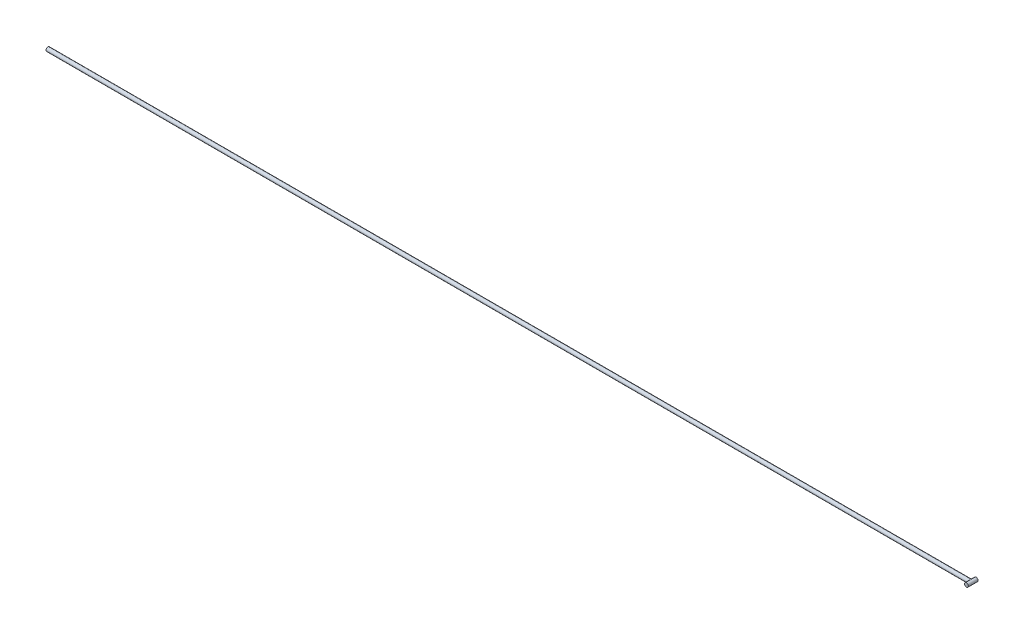
ISO-10303-21;
HEADER;
FILE_DESCRIPTION(('STEP AP214'),'2;1');
FILE_NAME('part.step','',(''),(''),'','','');
FILE_SCHEMA(('AUTOMOTIVE_DESIGN { 1 0 10303 214 1 1 1 1 }'));
ENDSEC;
DATA;
#1=APPLICATION_CONTEXT('core data for automotive mechanical design processes');
#2=APPLICATION_PROTOCOL_DEFINITION('international standard','automotive_design',2000,#1);
#3=PRODUCT_CONTEXT('',#1,'mechanical');
#4=PRODUCT('Part','Part','',(#3));
#5=PRODUCT_RELATED_PRODUCT_CATEGORY('part','',(#4));
#6=PRODUCT_DEFINITION_FORMATION('','',#4);
#7=PRODUCT_DEFINITION_CONTEXT('part definition',#1,'design');
#8=PRODUCT_DEFINITION('design','',#6,#7);
#9=PRODUCT_DEFINITION_SHAPE('','',#8);
#10=(LENGTH_UNIT() NAMED_UNIT(*) SI_UNIT(.MILLI.,.METRE.));
#11=(NAMED_UNIT(*) PLANE_ANGLE_UNIT() SI_UNIT($,.RADIAN.));
#12=(NAMED_UNIT(*) SI_UNIT($,.STERADIAN.) SOLID_ANGLE_UNIT());
#13=UNCERTAINTY_MEASURE_WITH_UNIT(LENGTH_MEASURE(1.E-05),#10,'distance_accuracy_value','');
#14=(GEOMETRIC_REPRESENTATION_CONTEXT(3) GLOBAL_UNCERTAINTY_ASSIGNED_CONTEXT((#13)) GLOBAL_UNIT_ASSIGNED_CONTEXT((#10,
#11,#12)) REPRESENTATION_CONTEXT('',''));
#15=CARTESIAN_POINT('',(0.,0.,0.));
#16=DIRECTION('',(0.,0.,1.));
#17=DIRECTION('',(1.,0.,0.));
#18=AXIS2_PLACEMENT_3D('',#15,#16,#17);
#19=CARTESIAN_POINT('',(-239.,0.,0.));
#20=DIRECTION('',(1.,0.,0.));
#21=DIRECTION('',(0.,0.,-1.));
#22=AXIS2_PLACEMENT_3D('',#19,#20,#21);
#23=PLANE('',#22);
#24=CARTESIAN_POINT('',(-239.,0.,0.));
#25=DIRECTION('',(1.,0.,0.));
#26=DIRECTION('',(0.,0.,-1.));
#27=AXIS2_PLACEMENT_3D('',#24,#25,#26);
#28=CIRCLE('',#27,1.);
#29=CARTESIAN_POINT('',(-239.,0.,-1.));
#30=VERTEX_POINT('',#29);
#31=EDGE_CURVE('E71',#30,#30,#28,.T.);
#32=ORIENTED_EDGE('',*,*,#31,.F.);
#33=EDGE_LOOP('',(#32));
#34=FACE_BOUND('',#33,.T.);
#35=ADVANCED_FACE('F51',(#34),#23,.F.);
#36=CARTESIAN_POINT('',(-239.,0.,0.));
#37=DIRECTION('',(1.,0.,0.));
#38=DIRECTION('',(0.,0.,-1.));
#39=AXIS2_PLACEMENT_3D('',#36,#37,#38);
#40=CYLINDRICAL_SURFACE('',#39,1.);
#41=CARTESIAN_POINT('',(239.,0.,0.));
#42=DIRECTION('',(0.707106781186547,0.,-0.707106781186547));
#43=DIRECTION('',(0.707106781186547,0.,0.707106781186547));
#44=AXIS2_PLACEMENT_3D('',#41,#42,#43);
#45=ELLIPSE('',#44,1.4142135623731,1.);
#46=CARTESIAN_POINT('',(239.,-1.,0.));
#47=VERTEX_POINT('',#46);
#48=CARTESIAN_POINT('',(239.,1.,0.));
#49=VERTEX_POINT('',#48);
#50=EDGE_CURVE('E12',#47,#49,#45,.T.);
#51=ORIENTED_EDGE('',*,*,#50,.F.);
#52=CARTESIAN_POINT('',(239.,0.,0.));
#53=DIRECTION('',(0.707106781186547,0.,0.707106781186547));
#54=DIRECTION('',(0.707106781186547,0.,-0.707106781186547));
#55=AXIS2_PLACEMENT_3D('',#52,#53,#54);
#56=ELLIPSE('',#55,1.4142135623731,1.);
#57=EDGE_CURVE('E59',#49,#47,#56,.T.);
#58=ORIENTED_EDGE('',*,*,#57,.F.);
#59=EDGE_LOOP('',(#51,#58));
#60=FACE_BOUND('',#59,.T.);
#61=ORIENTED_EDGE('',*,*,#31,.T.);
#62=EDGE_LOOP('',(#61));
#63=FACE_BOUND('',#62,.T.);
#64=ADVANCED_FACE('F65',(#60,#63),#40,.T.);
#65=CARTESIAN_POINT('',(239.,0.,2.5));
#66=DIRECTION('',(0.,0.,-1.));
#67=DIRECTION('',(-1.,0.,0.));
#68=AXIS2_PLACEMENT_3D('',#65,#66,#67);
#69=PLANE('',#68);
#70=CARTESIAN_POINT('',(239.,0.,2.5));
#71=DIRECTION('',(0.,0.,-1.));
#72=DIRECTION('',(-1.,0.,0.));
#73=AXIS2_PLACEMENT_3D('',#70,#71,#72);
#74=CIRCLE('',#73,1.);
#75=CARTESIAN_POINT('',(238.,0.,2.5));
#76=VERTEX_POINT('',#75);
#77=EDGE_CURVE('E80',#76,#76,#74,.T.);
#78=ORIENTED_EDGE('',*,*,#77,.F.);
#79=EDGE_LOOP('',(#78));
#80=FACE_BOUND('',#79,.T.);
#81=ADVANCED_FACE('F86',(#80),#69,.F.);
#82=CARTESIAN_POINT('',(239.,0.,-2.5));
#83=DIRECTION('',(0.,0.,-1.));
#84=DIRECTION('',(-1.,0.,0.));
#85=AXIS2_PLACEMENT_3D('',#82,#83,#84);
#86=PLANE('',#85);
#87=CARTESIAN_POINT('',(239.,0.,-2.5));
#88=DIRECTION('',(0.,0.,-1.));
#89=DIRECTION('',(-1.,0.,0.));
#90=AXIS2_PLACEMENT_3D('',#87,#88,#89);
#91=CIRCLE('',#90,1.);
#92=CARTESIAN_POINT('',(238.,0.,-2.5));
#93=VERTEX_POINT('',#92);
#94=EDGE_CURVE('E74',#93,#93,#91,.T.);
#95=ORIENTED_EDGE('',*,*,#94,.T.);
#96=EDGE_LOOP('',(#95));
#97=FACE_BOUND('',#96,.T.);
#98=ADVANCED_FACE('F88',(#97),#86,.T.);
#99=CARTESIAN_POINT('',(239.,0.,2.5));
#100=DIRECTION('',(0.,0.,-1.));
#101=DIRECTION('',(-1.,0.,0.));
#102=AXIS2_PLACEMENT_3D('',#99,#100,#101);
#103=CYLINDRICAL_SURFACE('',#102,1.);
#104=ORIENTED_EDGE('',*,*,#57,.T.);
#105=ORIENTED_EDGE('',*,*,#50,.T.);
#106=EDGE_LOOP('',(#104,#105));
#107=FACE_BOUND('',#106,.T.);
#108=ORIENTED_EDGE('',*,*,#94,.F.);
#109=EDGE_LOOP('',(#108));
#110=FACE_BOUND('',#109,.T.);
#111=ORIENTED_EDGE('',*,*,#77,.T.);
#112=EDGE_LOOP('',(#111));
#113=FACE_BOUND('',#112,.T.);
#114=ADVANCED_FACE('F68',(#107,#110,#113),#103,.T.);
#115=CLOSED_SHELL('',(#35,#64,#81,#98,#114));
#116=MANIFOLD_SOLID_BREP('B2',#115);
#117=ADVANCED_BREP_SHAPE_REPRESENTATION('',(#18,#116),#14);
#118=SHAPE_DEFINITION_REPRESENTATION(#9,#117);
ENDSEC;
END-ISO-10303-21;
